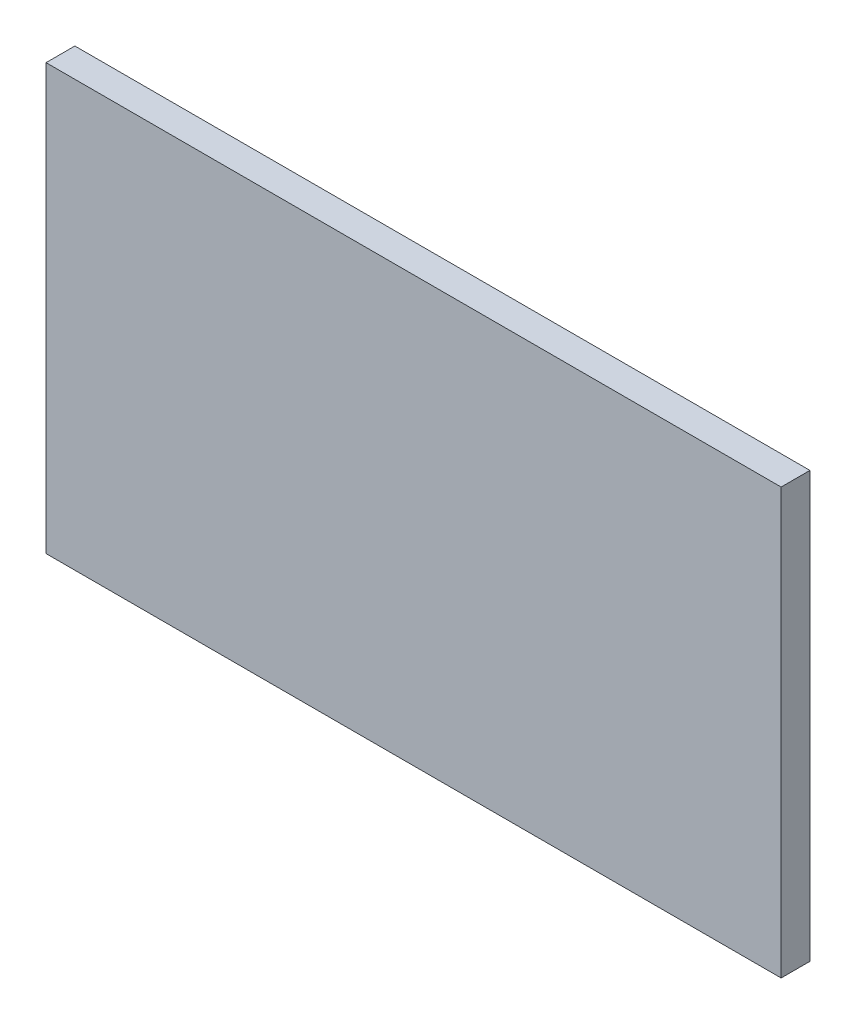
ISO-10303-21;
HEADER;
FILE_DESCRIPTION(('STEP AP214'),'2;1');
FILE_NAME('part.step','',(''),(''),'','','');
FILE_SCHEMA(('AUTOMOTIVE_DESIGN { 1 0 10303 214 1 1 1 1 }'));
ENDSEC;
DATA;
#1=APPLICATION_CONTEXT('core data for automotive mechanical design processes');
#2=APPLICATION_PROTOCOL_DEFINITION('international standard','automotive_design',2000,#1);
#3=PRODUCT_CONTEXT('',#1,'mechanical');
#4=PRODUCT('Part','Part','',(#3));
#5=PRODUCT_RELATED_PRODUCT_CATEGORY('part','',(#4));
#6=PRODUCT_DEFINITION_FORMATION('','',#4);
#7=PRODUCT_DEFINITION_CONTEXT('part definition',#1,'design');
#8=PRODUCT_DEFINITION('design','',#6,#7);
#9=PRODUCT_DEFINITION_SHAPE('','',#8);
#10=(LENGTH_UNIT() NAMED_UNIT(*) SI_UNIT(.MILLI.,.METRE.));
#11=(NAMED_UNIT(*) PLANE_ANGLE_UNIT() SI_UNIT($,.RADIAN.));
#12=(NAMED_UNIT(*) SI_UNIT($,.STERADIAN.) SOLID_ANGLE_UNIT());
#13=UNCERTAINTY_MEASURE_WITH_UNIT(LENGTH_MEASURE(1.E-05),#10,'distance_accuracy_value','');
#14=(GEOMETRIC_REPRESENTATION_CONTEXT(3) GLOBAL_UNCERTAINTY_ASSIGNED_CONTEXT((#13)) GLOBAL_UNIT_ASSIGNED_CONTEXT((#10,
#11,#12)) REPRESENTATION_CONTEXT('',''));
#15=CARTESIAN_POINT('',(0.,0.,0.));
#16=DIRECTION('',(0.,0.,1.));
#17=DIRECTION('',(1.,0.,0.));
#18=AXIS2_PLACEMENT_3D('',#15,#16,#17);
#19=CARTESIAN_POINT('',(0.,0.,40.));
#20=DIRECTION('',(1.,0.,0.));
#21=DIRECTION('',(0.,0.,-1.));
#22=AXIS2_PLACEMENT_3D('',#19,#20,#21);
#23=PLANE('',#22);
#24=DIRECTION('',(0.,-1.,0.));
#25=VECTOR('',#24,1.);
#26=CARTESIAN_POINT('',(0.,0.,0.));
#27=LINE('',#26,#25);
#28=CARTESIAN_POINT('',(0.,590.,0.));
#29=VERTEX_POINT('',#28);
#30=CARTESIAN_POINT('',(0.,0.,0.));
#31=VERTEX_POINT('',#30);
#32=EDGE_CURVE('E113',#29,#31,#27,.T.);
#33=ORIENTED_EDGE('',*,*,#32,.T.);
#34=DIRECTION('',(0.,0.,-1.));
#35=VECTOR('',#34,1.);
#36=CARTESIAN_POINT('',(0.,0.,40.));
#37=LINE('',#36,#35);
#38=CARTESIAN_POINT('',(0.,0.,40.));
#39=VERTEX_POINT('',#38);
#40=EDGE_CURVE('E11',#39,#31,#37,.T.);
#41=ORIENTED_EDGE('',*,*,#40,.F.);
#42=DIRECTION('',(0.,-1.,0.));
#43=VECTOR('',#42,1.);
#44=CARTESIAN_POINT('',(0.,0.,40.));
#45=LINE('',#44,#43);
#46=CARTESIAN_POINT('',(0.,590.,40.));
#47=VERTEX_POINT('',#46);
#48=EDGE_CURVE('E97',#47,#39,#45,.T.);
#49=ORIENTED_EDGE('',*,*,#48,.F.);
#50=DIRECTION('',(0.,0.,-1.));
#51=VECTOR('',#50,1.);
#52=CARTESIAN_POINT('',(0.,590.,40.));
#53=LINE('',#52,#51);
#54=EDGE_CURVE('E109',#47,#29,#53,.T.);
#55=ORIENTED_EDGE('',*,*,#54,.T.);
#56=EDGE_LOOP('',(#33,#41,#49,#55));
#57=FACE_BOUND('',#56,.T.);
#58=ADVANCED_FACE('F45',(#57),#23,.F.);
#59=CARTESIAN_POINT('',(0.,0.,40.));
#60=DIRECTION('',(0.,1.,0.));
#61=DIRECTION('',(0.,0.,1.));
#62=AXIS2_PLACEMENT_3D('',#59,#60,#61);
#63=PLANE('',#62);
#64=DIRECTION('',(1.,0.,0.));
#65=VECTOR('',#64,1.);
#66=CARTESIAN_POINT('',(0.,0.,0.));
#67=LINE('',#66,#65);
#68=CARTESIAN_POINT('',(1020.,0.,0.));
#69=VERTEX_POINT('',#68);
#70=EDGE_CURVE('E102',#31,#69,#67,.T.);
#71=ORIENTED_EDGE('',*,*,#70,.T.);
#72=DIRECTION('',(0.,0.,-1.));
#73=VECTOR('',#72,1.);
#74=CARTESIAN_POINT('',(1020.,0.,40.));
#75=LINE('',#74,#73);
#76=CARTESIAN_POINT('',(1020.,0.,40.));
#77=VERTEX_POINT('',#76);
#78=EDGE_CURVE('E54',#77,#69,#75,.T.);
#79=ORIENTED_EDGE('',*,*,#78,.F.);
#80=DIRECTION('',(1.,0.,0.));
#81=VECTOR('',#80,1.);
#82=CARTESIAN_POINT('',(0.,0.,40.));
#83=LINE('',#82,#81);
#84=EDGE_CURVE('E92',#39,#77,#83,.T.);
#85=ORIENTED_EDGE('',*,*,#84,.F.);
#86=ORIENTED_EDGE('',*,*,#40,.T.);
#87=EDGE_LOOP('',(#71,#79,#85,#86));
#88=FACE_BOUND('',#87,.T.);
#89=ADVANCED_FACE('F101',(#88),#63,.F.);
#90=CARTESIAN_POINT('',(1020.,0.,40.));
#91=DIRECTION('',(-1.,0.,0.));
#92=DIRECTION('',(0.,0.,1.));
#93=AXIS2_PLACEMENT_3D('',#90,#91,#92);
#94=PLANE('',#93);
#95=DIRECTION('',(0.,1.,0.));
#96=VECTOR('',#95,1.);
#97=CARTESIAN_POINT('',(1020.,0.,0.));
#98=LINE('',#97,#96);
#99=CARTESIAN_POINT('',(1020.,590.,0.));
#100=VERTEX_POINT('',#99);
#101=EDGE_CURVE('E79',#69,#100,#98,.T.);
#102=ORIENTED_EDGE('',*,*,#101,.T.);
#103=DIRECTION('',(0.,0.,-1.));
#104=VECTOR('',#103,1.);
#105=CARTESIAN_POINT('',(1020.,590.,40.));
#106=LINE('',#105,#104);
#107=CARTESIAN_POINT('',(1020.,590.,40.));
#108=VERTEX_POINT('',#107);
#109=EDGE_CURVE('E104',#108,#100,#106,.T.);
#110=ORIENTED_EDGE('',*,*,#109,.F.);
#111=DIRECTION('',(0.,1.,0.));
#112=VECTOR('',#111,1.);
#113=CARTESIAN_POINT('',(1020.,0.,40.));
#114=LINE('',#113,#112);
#115=EDGE_CURVE('E95',#77,#108,#114,.T.);
#116=ORIENTED_EDGE('',*,*,#115,.F.);
#117=ORIENTED_EDGE('',*,*,#78,.T.);
#118=EDGE_LOOP('',(#102,#110,#116,#117));
#119=FACE_BOUND('',#118,.T.);
#120=ADVANCED_FACE('F105',(#119),#94,.F.);
#121=CARTESIAN_POINT('',(0.,590.,40.));
#122=DIRECTION('',(0.,-1.,0.));
#123=DIRECTION('',(0.,0.,-1.));
#124=AXIS2_PLACEMENT_3D('',#121,#122,#123);
#125=PLANE('',#124);
#126=DIRECTION('',(-1.,0.,0.));
#127=VECTOR('',#126,1.);
#128=CARTESIAN_POINT('',(0.,590.,0.));
#129=LINE('',#128,#127);
#130=EDGE_CURVE('E85',#100,#29,#129,.T.);
#131=ORIENTED_EDGE('',*,*,#130,.T.);
#132=ORIENTED_EDGE('',*,*,#54,.F.);
#133=DIRECTION('',(-1.,0.,0.));
#134=VECTOR('',#133,1.);
#135=CARTESIAN_POINT('',(0.,590.,40.));
#136=LINE('',#135,#134);
#137=EDGE_CURVE('E62',#108,#47,#136,.T.);
#138=ORIENTED_EDGE('',*,*,#137,.F.);
#139=ORIENTED_EDGE('',*,*,#109,.T.);
#140=EDGE_LOOP('',(#131,#132,#138,#139));
#141=FACE_BOUND('',#140,.T.);
#142=ADVANCED_FACE('F127',(#141),#125,.F.);
#143=CARTESIAN_POINT('',(0.,0.,40.));
#144=DIRECTION('',(0.,0.,-1.));
#145=DIRECTION('',(-1.,0.,0.));
#146=AXIS2_PLACEMENT_3D('',#143,#144,#145);
#147=PLANE('',#146);
#148=ORIENTED_EDGE('',*,*,#48,.T.);
#149=ORIENTED_EDGE('',*,*,#84,.T.);
#150=ORIENTED_EDGE('',*,*,#115,.T.);
#151=ORIENTED_EDGE('',*,*,#137,.T.);
#152=EDGE_LOOP('',(#148,#149,#150,#151));
#153=FACE_BOUND('',#152,.T.);
#154=ADVANCED_FACE('F93',(#153),#147,.F.);
#155=CARTESIAN_POINT('',(0.,0.,0.));
#156=DIRECTION('',(0.,0.,-1.));
#157=DIRECTION('',(-1.,0.,0.));
#158=AXIS2_PLACEMENT_3D('',#155,#156,#157);
#159=PLANE('',#158);
#160=CARTESIAN_POINT('',(950.,22.5,0.));
#161=DIRECTION('',(0.,0.,-1.));
#162=DIRECTION('',(-1.,0.,0.));
#163=AXIS2_PLACEMENT_3D('',#160,#161,#162);
#164=CIRCLE('',#163,7.00000000000004);
#165=CARTESIAN_POINT('',(943.,22.5,0.));
#166=VERTEX_POINT('',#165);
#167=EDGE_CURVE('E146',#166,#166,#164,.T.);
#168=ORIENTED_EDGE('',*,*,#167,.F.);
#169=EDGE_LOOP('',(#168));
#170=FACE_BOUND('',#169,.T.);
#171=CARTESIAN_POINT('',(950.,567.5,0.));
#172=DIRECTION('',(0.,0.,-1.));
#173=DIRECTION('',(-1.,0.,0.));
#174=AXIS2_PLACEMENT_3D('',#171,#172,#173);
#175=CIRCLE('',#174,7.00000000000004);
#176=CARTESIAN_POINT('',(943.,567.5,0.));
#177=VERTEX_POINT('',#176);
#178=EDGE_CURVE('E154',#177,#177,#175,.T.);
#179=ORIENTED_EDGE('',*,*,#178,.F.);
#180=EDGE_LOOP('',(#179));
#181=FACE_BOUND('',#180,.T.);
#182=CARTESIAN_POINT('',(70.,567.5,0.));
#183=DIRECTION('',(0.,0.,-1.));
#184=DIRECTION('',(-1.,0.,0.));
#185=AXIS2_PLACEMENT_3D('',#182,#183,#184);
#186=CIRCLE('',#185,7.);
#187=CARTESIAN_POINT('',(63.,567.5,0.));
#188=VERTEX_POINT('',#187);
#189=EDGE_CURVE('E138',#188,#188,#186,.T.);
#190=ORIENTED_EDGE('',*,*,#189,.F.);
#191=EDGE_LOOP('',(#190));
#192=FACE_BOUND('',#191,.T.);
#193=CARTESIAN_POINT('',(70.,22.5,0.));
#194=DIRECTION('',(0.,0.,-1.));
#195=DIRECTION('',(-1.,0.,0.));
#196=AXIS2_PLACEMENT_3D('',#193,#194,#195);
#197=CIRCLE('',#196,7.00000000000002);
#198=CARTESIAN_POINT('',(63.,22.5,0.));
#199=VERTEX_POINT('',#198);
#200=EDGE_CURVE('E134',#199,#199,#197,.T.);
#201=ORIENTED_EDGE('',*,*,#200,.F.);
#202=EDGE_LOOP('',(#201));
#203=FACE_BOUND('',#202,.T.);
#204=ORIENTED_EDGE('',*,*,#32,.F.);
#205=ORIENTED_EDGE('',*,*,#130,.F.);
#206=ORIENTED_EDGE('',*,*,#101,.F.);
#207=ORIENTED_EDGE('',*,*,#70,.F.);
#208=EDGE_LOOP('',(#204,#205,#206,#207));
#209=FACE_BOUND('',#208,.T.);
#210=ADVANCED_FACE('F130',(#170,#181,#192,#203,#209),#159,.T.);
#211=CARTESIAN_POINT('',(70.,22.5,20.));
#212=DIRECTION('',(0.,0.,-1.));
#213=DIRECTION('',(-1.,0.,0.));
#214=AXIS2_PLACEMENT_3D('',#211,#212,#213);
#215=CYLINDRICAL_SURFACE('',#214,7.00000000000002);
#216=CARTESIAN_POINT('',(70.,22.5,20.));
#217=DIRECTION('',(0.,0.,-1.));
#218=DIRECTION('',(-1.,0.,0.));
#219=AXIS2_PLACEMENT_3D('',#216,#217,#218);
#220=CIRCLE('',#219,7.00000000000002);
#221=CARTESIAN_POINT('',(63.,22.5,20.));
#222=VERTEX_POINT('',#221);
#223=EDGE_CURVE('E117',#222,#222,#220,.T.);
#224=ORIENTED_EDGE('',*,*,#223,.F.);
#225=EDGE_LOOP('',(#224));
#226=FACE_BOUND('',#225,.T.);
#227=ORIENTED_EDGE('',*,*,#200,.T.);
#228=EDGE_LOOP('',(#227));
#229=FACE_BOUND('',#228,.T.);
#230=ADVANCED_FACE('F170',(#226,#229),#215,.F.);
#231=CARTESIAN_POINT('',(70.,22.5,20.));
#232=DIRECTION('',(0.,0.,-1.));
#233=DIRECTION('',(-1.,0.,0.));
#234=AXIS2_PLACEMENT_3D('',#231,#232,#233);
#235=PLANE('',#234);
#236=ORIENTED_EDGE('',*,*,#223,.T.);
#237=EDGE_LOOP('',(#236));
#238=FACE_BOUND('',#237,.T.);
#239=ADVANCED_FACE('F176',(#238),#235,.T.);
#240=CARTESIAN_POINT('',(70.,567.5,20.));
#241=DIRECTION('',(0.,0.,-1.));
#242=DIRECTION('',(-1.,0.,0.));
#243=AXIS2_PLACEMENT_3D('',#240,#241,#242);
#244=CYLINDRICAL_SURFACE('',#243,7.);
#245=CARTESIAN_POINT('',(70.,567.5,20.));
#246=DIRECTION('',(0.,0.,-1.));
#247=DIRECTION('',(-1.,0.,0.));
#248=AXIS2_PLACEMENT_3D('',#245,#246,#247);
#249=CIRCLE('',#248,7.);
#250=CARTESIAN_POINT('',(63.,567.5,20.));
#251=VERTEX_POINT('',#250);
#252=EDGE_CURVE('E158',#251,#251,#249,.T.);
#253=ORIENTED_EDGE('',*,*,#252,.F.);
#254=EDGE_LOOP('',(#253));
#255=FACE_BOUND('',#254,.T.);
#256=ORIENTED_EDGE('',*,*,#189,.T.);
#257=EDGE_LOOP('',(#256));
#258=FACE_BOUND('',#257,.T.);
#259=ADVANCED_FACE('F166',(#255,#258),#244,.F.);
#260=CARTESIAN_POINT('',(70.,567.5,20.));
#261=DIRECTION('',(0.,0.,-1.));
#262=DIRECTION('',(-1.,0.,0.));
#263=AXIS2_PLACEMENT_3D('',#260,#261,#262);
#264=PLANE('',#263);
#265=ORIENTED_EDGE('',*,*,#252,.T.);
#266=EDGE_LOOP('',(#265));
#267=FACE_BOUND('',#266,.T.);
#268=ADVANCED_FACE('F226',(#267),#264,.T.);
#269=CARTESIAN_POINT('',(950.,567.5,20.));
#270=DIRECTION('',(0.,0.,-1.));
#271=DIRECTION('',(-1.,0.,0.));
#272=AXIS2_PLACEMENT_3D('',#269,#270,#271);
#273=CYLINDRICAL_SURFACE('',#272,7.00000000000004);
#274=CARTESIAN_POINT('',(950.,567.5,20.));
#275=DIRECTION('',(0.,0.,-1.));
#276=DIRECTION('',(-1.,0.,0.));
#277=AXIS2_PLACEMENT_3D('',#274,#275,#276);
#278=CIRCLE('',#277,7.00000000000004);
#279=CARTESIAN_POINT('',(943.,567.5,20.));
#280=VERTEX_POINT('',#279);
#281=EDGE_CURVE('E150',#280,#280,#278,.T.);
#282=ORIENTED_EDGE('',*,*,#281,.F.);
#283=EDGE_LOOP('',(#282));
#284=FACE_BOUND('',#283,.T.);
#285=ORIENTED_EDGE('',*,*,#178,.T.);
#286=EDGE_LOOP('',(#285));
#287=FACE_BOUND('',#286,.T.);
#288=ADVANCED_FACE('F236',(#284,#287),#273,.F.);
#289=CARTESIAN_POINT('',(950.,567.5,20.));
#290=DIRECTION('',(0.,0.,-1.));
#291=DIRECTION('',(-1.,0.,0.));
#292=AXIS2_PLACEMENT_3D('',#289,#290,#291);
#293=PLANE('',#292);
#294=ORIENTED_EDGE('',*,*,#281,.T.);
#295=EDGE_LOOP('',(#294));
#296=FACE_BOUND('',#295,.T.);
#297=ADVANCED_FACE('F246',(#296),#293,.T.);
#298=CARTESIAN_POINT('',(950.,22.5,20.));
#299=DIRECTION('',(0.,0.,-1.));
#300=DIRECTION('',(-1.,0.,0.));
#301=AXIS2_PLACEMENT_3D('',#298,#299,#300);
#302=CYLINDRICAL_SURFACE('',#301,7.00000000000004);
#303=CARTESIAN_POINT('',(950.,22.5,20.));
#304=DIRECTION('',(0.,0.,-1.));
#305=DIRECTION('',(-1.,0.,0.));
#306=AXIS2_PLACEMENT_3D('',#303,#304,#305);
#307=CIRCLE('',#306,7.00000000000004);
#308=CARTESIAN_POINT('',(943.,22.5,20.));
#309=VERTEX_POINT('',#308);
#310=EDGE_CURVE('E142',#309,#309,#307,.T.);
#311=ORIENTED_EDGE('',*,*,#310,.F.);
#312=EDGE_LOOP('',(#311));
#313=FACE_BOUND('',#312,.T.);
#314=ORIENTED_EDGE('',*,*,#167,.T.);
#315=EDGE_LOOP('',(#314));
#316=FACE_BOUND('',#315,.T.);
#317=ADVANCED_FACE('F256',(#313,#316),#302,.F.);
#318=CARTESIAN_POINT('',(950.,22.5,20.));
#319=DIRECTION('',(0.,0.,-1.));
#320=DIRECTION('',(-1.,0.,0.));
#321=AXIS2_PLACEMENT_3D('',#318,#319,#320);
#322=PLANE('',#321);
#323=ORIENTED_EDGE('',*,*,#310,.T.);
#324=EDGE_LOOP('',(#323));
#325=FACE_BOUND('',#324,.T.);
#326=ADVANCED_FACE('F266',(#325),#322,.T.);
#327=CLOSED_SHELL('',(#58,#89,#120,#142,#154,#210,#230,#239,#259,#268,#288,#297,#317,#326));
#328=MANIFOLD_SOLID_BREP('B2',#327);
#329=ADVANCED_BREP_SHAPE_REPRESENTATION('',(#18,#328),#14);
#330=SHAPE_DEFINITION_REPRESENTATION(#9,#329);
ENDSEC;
END-ISO-10303-21;
